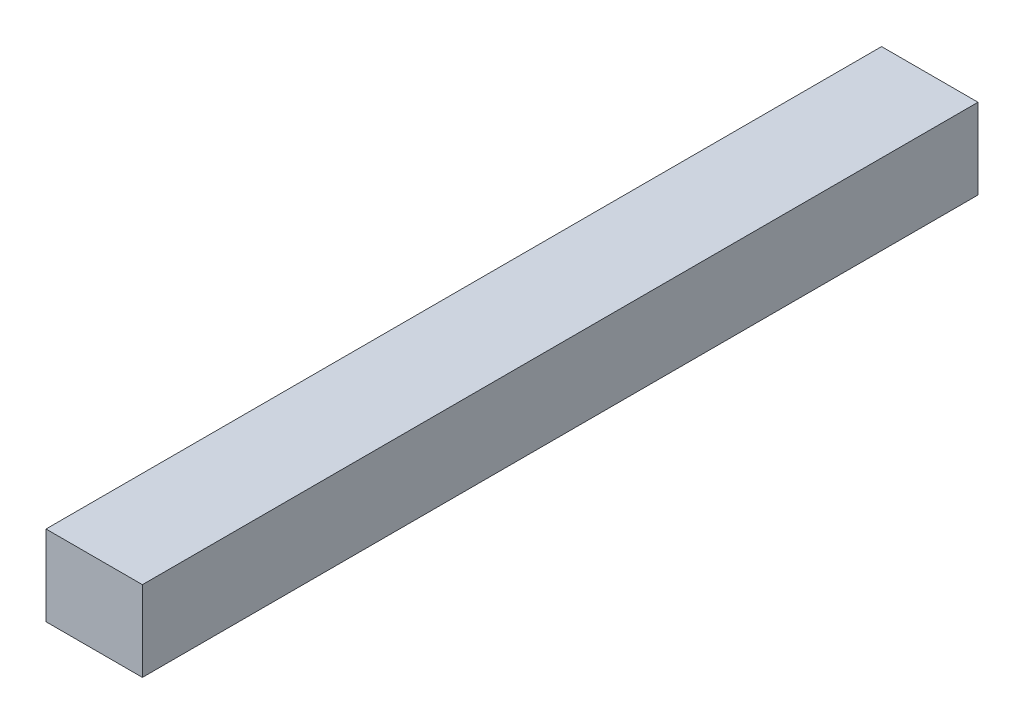
ISO-10303-21;
HEADER;
FILE_DESCRIPTION(('STEP AP214'),'2;1');
FILE_NAME('part.step','',(''),(''),'','','');
FILE_SCHEMA(('AUTOMOTIVE_DESIGN { 1 0 10303 214 1 1 1 1 }'));
ENDSEC;
DATA;
#1=APPLICATION_CONTEXT('core data for automotive mechanical design processes');
#2=APPLICATION_PROTOCOL_DEFINITION('international standard','automotive_design',2000,#1);
#3=PRODUCT_CONTEXT('',#1,'mechanical');
#4=PRODUCT('Part','Part','',(#3));
#5=PRODUCT_RELATED_PRODUCT_CATEGORY('part','',(#4));
#6=PRODUCT_DEFINITION_FORMATION('','',#4);
#7=PRODUCT_DEFINITION_CONTEXT('part definition',#1,'design');
#8=PRODUCT_DEFINITION('design','',#6,#7);
#9=PRODUCT_DEFINITION_SHAPE('','',#8);
#10=(LENGTH_UNIT() NAMED_UNIT(*) SI_UNIT(.MILLI.,.METRE.));
#11=(NAMED_UNIT(*) PLANE_ANGLE_UNIT() SI_UNIT($,.RADIAN.));
#12=(NAMED_UNIT(*) SI_UNIT($,.STERADIAN.) SOLID_ANGLE_UNIT());
#13=UNCERTAINTY_MEASURE_WITH_UNIT(LENGTH_MEASURE(1.E-05),#10,'distance_accuracy_value','');
#14=(GEOMETRIC_REPRESENTATION_CONTEXT(3) GLOBAL_UNCERTAINTY_ASSIGNED_CONTEXT((#13)) GLOBAL_UNIT_ASSIGNED_CONTEXT((#10,
#11,#12)) REPRESENTATION_CONTEXT('',''));
#15=CARTESIAN_POINT('',(0.,0.,0.));
#16=DIRECTION('',(0.,0.,1.));
#17=DIRECTION('',(1.,0.,0.));
#18=AXIS2_PLACEMENT_3D('',#15,#16,#17);
#19=CARTESIAN_POINT('',(-3.,174.,23.));
#20=DIRECTION('',(0.,0.,-1.));
#21=DIRECTION('',(-1.,0.,0.));
#22=AXIS2_PLACEMENT_3D('',#19,#20,#21);
#23=PLANE('',#22);
#24=DIRECTION('',(0.,-1.,0.));
#25=VECTOR('',#24,1.);
#26=CARTESIAN_POINT('',(0.,174.,23.));
#27=LINE('',#26,#25);
#28=CARTESIAN_POINT('',(0.,171.5,23.));
#29=VERTEX_POINT('',#28);
#30=CARTESIAN_POINT('',(0.,174.,23.));
#31=VERTEX_POINT('',#30);
#32=EDGE_CURVE('E90',#29,#31,#27,.F.);
#33=ORIENTED_EDGE('',*,*,#32,.T.);
#34=DIRECTION('',(1.,0.,0.));
#35=VECTOR('',#34,1.);
#36=CARTESIAN_POINT('',(-3.,174.,23.));
#37=LINE('',#36,#35);
#38=CARTESIAN_POINT('',(-3.,174.,23.));
#39=VERTEX_POINT('',#38);
#40=EDGE_CURVE('E20',#31,#39,#37,.F.);
#41=ORIENTED_EDGE('',*,*,#40,.T.);
#42=DIRECTION('',(0.,-1.,0.));
#43=VECTOR('',#42,1.);
#44=CARTESIAN_POINT('',(-3.,174.,23.));
#45=LINE('',#44,#43);
#46=CARTESIAN_POINT('',(-3.,171.5,23.));
#47=VERTEX_POINT('',#46);
#48=EDGE_CURVE('E65',#47,#39,#45,.F.);
#49=ORIENTED_EDGE('',*,*,#48,.F.);
#50=DIRECTION('',(1.,0.,0.));
#51=VECTOR('',#50,1.);
#52=CARTESIAN_POINT('',(-3.,171.5,23.));
#53=LINE('',#52,#51);
#54=EDGE_CURVE('E11',#29,#47,#53,.F.);
#55=ORIENTED_EDGE('',*,*,#54,.F.);
#56=EDGE_LOOP('',(#33,#41,#49,#55));
#57=FACE_BOUND('',#56,.T.);
#58=ADVANCED_FACE('F17',(#57),#23,.F.);
#59=CARTESIAN_POINT('',(-3.,171.5,23.));
#60=DIRECTION('',(0.,1.,0.));
#61=DIRECTION('',(0.,0.,-1.));
#62=AXIS2_PLACEMENT_3D('',#59,#60,#61);
#63=PLANE('',#62);
#64=DIRECTION('',(0.,0.,-1.));
#65=VECTOR('',#64,1.);
#66=CARTESIAN_POINT('',(0.,171.5,23.));
#67=LINE('',#66,#65);
#68=CARTESIAN_POINT('',(0.,171.5,-3.));
#69=VERTEX_POINT('',#68);
#70=EDGE_CURVE('E75',#69,#29,#67,.F.);
#71=ORIENTED_EDGE('',*,*,#70,.T.);
#72=ORIENTED_EDGE('',*,*,#54,.T.);
#73=DIRECTION('',(0.,0.,-1.));
#74=VECTOR('',#73,1.);
#75=CARTESIAN_POINT('',(-3.,171.5,23.));
#76=LINE('',#75,#74);
#77=CARTESIAN_POINT('',(-3.,171.5,-3.));
#78=VERTEX_POINT('',#77);
#79=EDGE_CURVE('E62',#78,#47,#76,.F.);
#80=ORIENTED_EDGE('',*,*,#79,.F.);
#81=DIRECTION('',(1.,0.,0.));
#82=VECTOR('',#81,1.);
#83=CARTESIAN_POINT('',(-3.,171.5,-3.));
#84=LINE('',#83,#82);
#85=EDGE_CURVE('E27',#69,#78,#84,.F.);
#86=ORIENTED_EDGE('',*,*,#85,.F.);
#87=EDGE_LOOP('',(#71,#72,#80,#86));
#88=FACE_BOUND('',#87,.T.);
#89=ADVANCED_FACE('F73',(#88),#63,.F.);
#90=CARTESIAN_POINT('',(-3.,171.5,-3.));
#91=DIRECTION('',(0.,0.,1.));
#92=DIRECTION('',(1.,0.,0.));
#93=AXIS2_PLACEMENT_3D('',#90,#91,#92);
#94=PLANE('',#93);
#95=DIRECTION('',(0.,1.,0.));
#96=VECTOR('',#95,1.);
#97=CARTESIAN_POINT('',(0.,171.5,-3.));
#98=LINE('',#97,#96);
#99=CARTESIAN_POINT('',(0.,174.,-3.));
#100=VERTEX_POINT('',#99);
#101=EDGE_CURVE('E52',#100,#69,#98,.F.);
#102=ORIENTED_EDGE('',*,*,#101,.T.);
#103=ORIENTED_EDGE('',*,*,#85,.T.);
#104=DIRECTION('',(0.,1.,0.));
#105=VECTOR('',#104,1.);
#106=CARTESIAN_POINT('',(-3.,171.5,-3.));
#107=LINE('',#106,#105);
#108=CARTESIAN_POINT('',(-3.,174.,-3.));
#109=VERTEX_POINT('',#108);
#110=EDGE_CURVE('E68',#109,#78,#107,.F.);
#111=ORIENTED_EDGE('',*,*,#110,.F.);
#112=DIRECTION('',(1.,0.,0.));
#113=VECTOR('',#112,1.);
#114=CARTESIAN_POINT('',(-3.,174.,-3.));
#115=LINE('',#114,#113);
#116=EDGE_CURVE('E97',#100,#109,#115,.F.);
#117=ORIENTED_EDGE('',*,*,#116,.F.);
#118=EDGE_LOOP('',(#102,#103,#111,#117));
#119=FACE_BOUND('',#118,.T.);
#120=ADVANCED_FACE('F103',(#119),#94,.F.);
#121=CARTESIAN_POINT('',(-3.,174.,-3.));
#122=DIRECTION('',(0.,-1.,0.));
#123=DIRECTION('',(0.,0.,1.));
#124=AXIS2_PLACEMENT_3D('',#121,#122,#123);
#125=PLANE('',#124);
#126=DIRECTION('',(0.,0.,1.));
#127=VECTOR('',#126,1.);
#128=CARTESIAN_POINT('',(0.,174.,-3.));
#129=LINE('',#128,#127);
#130=EDGE_CURVE('E58',#31,#100,#129,.F.);
#131=ORIENTED_EDGE('',*,*,#130,.T.);
#132=ORIENTED_EDGE('',*,*,#116,.T.);
#133=DIRECTION('',(0.,0.,1.));
#134=VECTOR('',#133,1.);
#135=CARTESIAN_POINT('',(-3.,174.,-3.));
#136=LINE('',#135,#134);
#137=EDGE_CURVE('E35',#39,#109,#136,.F.);
#138=ORIENTED_EDGE('',*,*,#137,.F.);
#139=ORIENTED_EDGE('',*,*,#40,.F.);
#140=EDGE_LOOP('',(#131,#132,#138,#139));
#141=FACE_BOUND('',#140,.T.);
#142=ADVANCED_FACE('F106',(#141),#125,.F.);
#143=CARTESIAN_POINT('',(-3.,190.5,0.));
#144=DIRECTION('',(-1.,0.,0.));
#145=DIRECTION('',(0.,0.,1.));
#146=AXIS2_PLACEMENT_3D('',#143,#144,#145);
#147=PLANE('',#146);
#148=ORIENTED_EDGE('',*,*,#48,.T.);
#149=ORIENTED_EDGE('',*,*,#137,.T.);
#150=ORIENTED_EDGE('',*,*,#110,.T.);
#151=ORIENTED_EDGE('',*,*,#79,.T.);
#152=EDGE_LOOP('',(#148,#149,#150,#151));
#153=FACE_BOUND('',#152,.T.);
#154=ADVANCED_FACE('F63',(#153),#147,.T.);
#155=CARTESIAN_POINT('',(0.,190.5,0.));
#156=DIRECTION('',(-1.,0.,0.));
#157=DIRECTION('',(0.,0.,1.));
#158=AXIS2_PLACEMENT_3D('',#155,#156,#157);
#159=PLANE('',#158);
#160=ORIENTED_EDGE('',*,*,#32,.F.);
#161=ORIENTED_EDGE('',*,*,#70,.F.);
#162=ORIENTED_EDGE('',*,*,#101,.F.);
#163=ORIENTED_EDGE('',*,*,#130,.F.);
#164=EDGE_LOOP('',(#160,#161,#162,#163));
#165=FACE_BOUND('',#164,.T.);
#166=ADVANCED_FACE('F105',(#165),#159,.F.);
#167=CLOSED_SHELL('',(#58,#89,#120,#142,#154,#166));
#168=MANIFOLD_SOLID_BREP('B1',#167);
#169=ADVANCED_BREP_SHAPE_REPRESENTATION('',(#18,#168),#14);
#170=SHAPE_DEFINITION_REPRESENTATION(#9,#169);
ENDSEC;
END-ISO-10303-21;
